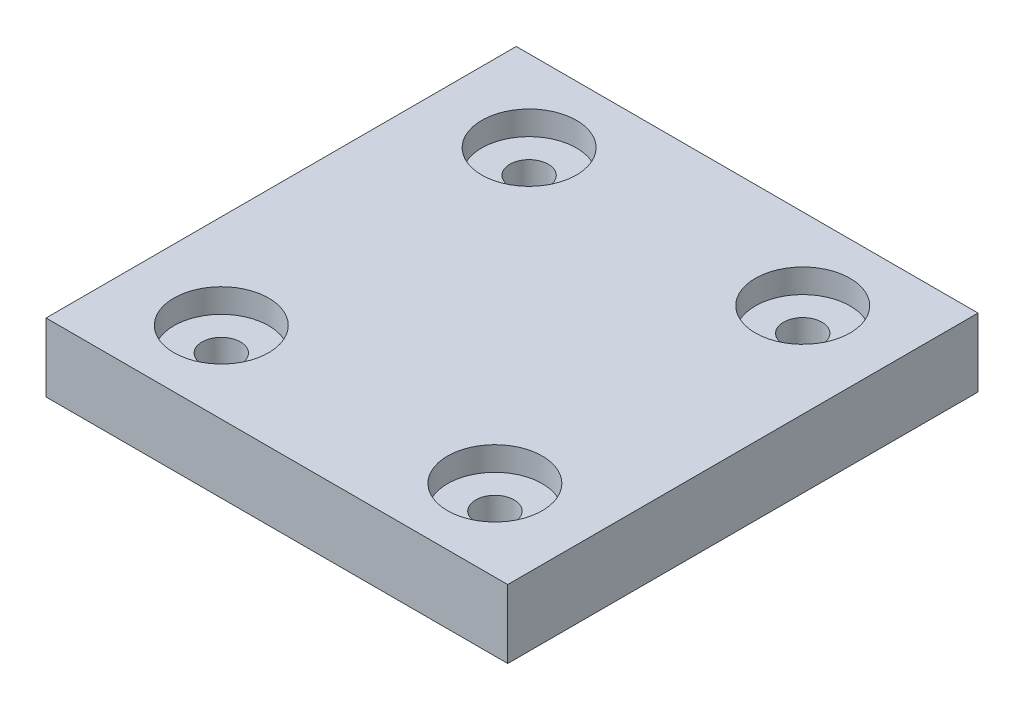
ISO-10303-21;
HEADER;
FILE_DESCRIPTION(('STEP AP214'),'2;1');
FILE_NAME('part.step','',(''),(''),'','','');
FILE_SCHEMA(('AUTOMOTIVE_DESIGN { 1 0 10303 214 1 1 1 1 }'));
ENDSEC;
DATA;
#1=APPLICATION_CONTEXT('core data for automotive mechanical design processes');
#2=APPLICATION_PROTOCOL_DEFINITION('international standard','automotive_design',2000,#1);
#3=PRODUCT_CONTEXT('',#1,'mechanical');
#4=PRODUCT('Part','Part','',(#3));
#5=PRODUCT_RELATED_PRODUCT_CATEGORY('part','',(#4));
#6=PRODUCT_DEFINITION_FORMATION('','',#4);
#7=PRODUCT_DEFINITION_CONTEXT('part definition',#1,'design');
#8=PRODUCT_DEFINITION('design','',#6,#7);
#9=PRODUCT_DEFINITION_SHAPE('','',#8);
#10=(LENGTH_UNIT() NAMED_UNIT(*) SI_UNIT(.MILLI.,.METRE.));
#11=(NAMED_UNIT(*) PLANE_ANGLE_UNIT() SI_UNIT($,.RADIAN.));
#12=(NAMED_UNIT(*) SI_UNIT($,.STERADIAN.) SOLID_ANGLE_UNIT());
#13=UNCERTAINTY_MEASURE_WITH_UNIT(LENGTH_MEASURE(1.E-05),#10,'distance_accuracy_value','');
#14=(GEOMETRIC_REPRESENTATION_CONTEXT(3) GLOBAL_UNCERTAINTY_ASSIGNED_CONTEXT((#13)) GLOBAL_UNIT_ASSIGNED_CONTEXT((#10,
#11,#12)) REPRESENTATION_CONTEXT('',''));
#15=CARTESIAN_POINT('',(0.,0.,0.));
#16=DIRECTION('',(0.,0.,1.));
#17=DIRECTION('',(1.,0.,0.));
#18=AXIS2_PLACEMENT_3D('',#15,#16,#17);
#19=CARTESIAN_POINT('',(27.,8.,-27.5));
#20=DIRECTION('',(-1.,0.,0.));
#21=DIRECTION('',(0.,0.,1.));
#22=AXIS2_PLACEMENT_3D('',#19,#20,#21);
#23=PLANE('',#22);
#24=DIRECTION('',(0.,0.,-1.));
#25=VECTOR('',#24,1.);
#26=CARTESIAN_POINT('',(27.,0.,-27.5));
#27=LINE('',#26,#25);
#28=CARTESIAN_POINT('',(27.,0.,27.5));
#29=VERTEX_POINT('',#28);
#30=CARTESIAN_POINT('',(27.,0.,-27.5));
#31=VERTEX_POINT('',#30);
#32=EDGE_CURVE('E107',#29,#31,#27,.T.);
#33=ORIENTED_EDGE('',*,*,#32,.T.);
#34=DIRECTION('',(0.,-1.,0.));
#35=VECTOR('',#34,1.);
#36=CARTESIAN_POINT('',(27.,8.,-27.5));
#37=LINE('',#36,#35);
#38=CARTESIAN_POINT('',(27.,8.,-27.5));
#39=VERTEX_POINT('',#38);
#40=EDGE_CURVE('E11',#39,#31,#37,.T.);
#41=ORIENTED_EDGE('',*,*,#40,.F.);
#42=DIRECTION('',(0.,0.,-1.));
#43=VECTOR('',#42,1.);
#44=CARTESIAN_POINT('',(27.,8.,-27.5));
#45=LINE('',#44,#43);
#46=CARTESIAN_POINT('',(27.,8.,27.5));
#47=VERTEX_POINT('',#46);
#48=EDGE_CURVE('E91',#47,#39,#45,.T.);
#49=ORIENTED_EDGE('',*,*,#48,.F.);
#50=DIRECTION('',(0.,-1.,0.));
#51=VECTOR('',#50,1.);
#52=CARTESIAN_POINT('',(27.,8.,27.5));
#53=LINE('',#52,#51);
#54=EDGE_CURVE('E103',#47,#29,#53,.T.);
#55=ORIENTED_EDGE('',*,*,#54,.T.);
#56=EDGE_LOOP('',(#33,#41,#49,#55));
#57=FACE_BOUND('',#56,.T.);
#58=ADVANCED_FACE('F39',(#57),#23,.F.);
#59=CARTESIAN_POINT('',(-27.,8.,-27.5));
#60=DIRECTION('',(0.,0.,1.));
#61=DIRECTION('',(1.,0.,0.));
#62=AXIS2_PLACEMENT_3D('',#59,#60,#61);
#63=PLANE('',#62);
#64=DIRECTION('',(-1.,0.,0.));
#65=VECTOR('',#64,1.);
#66=CARTESIAN_POINT('',(-27.,0.,-27.5));
#67=LINE('',#66,#65);
#68=CARTESIAN_POINT('',(-27.,0.,-27.5));
#69=VERTEX_POINT('',#68);
#70=EDGE_CURVE('E96',#31,#69,#67,.T.);
#71=ORIENTED_EDGE('',*,*,#70,.T.);
#72=DIRECTION('',(0.,-1.,0.));
#73=VECTOR('',#72,1.);
#74=CARTESIAN_POINT('',(-27.,8.,-27.5));
#75=LINE('',#74,#73);
#76=CARTESIAN_POINT('',(-27.,8.,-27.5));
#77=VERTEX_POINT('',#76);
#78=EDGE_CURVE('E48',#77,#69,#75,.T.);
#79=ORIENTED_EDGE('',*,*,#78,.F.);
#80=DIRECTION('',(-1.,0.,0.));
#81=VECTOR('',#80,1.);
#82=CARTESIAN_POINT('',(-27.,8.,-27.5));
#83=LINE('',#82,#81);
#84=EDGE_CURVE('E86',#39,#77,#83,.T.);
#85=ORIENTED_EDGE('',*,*,#84,.F.);
#86=ORIENTED_EDGE('',*,*,#40,.T.);
#87=EDGE_LOOP('',(#71,#79,#85,#86));
#88=FACE_BOUND('',#87,.T.);
#89=ADVANCED_FACE('F95',(#88),#63,.F.);
#90=CARTESIAN_POINT('',(-27.,8.,-27.5));
#91=DIRECTION('',(1.,0.,0.));
#92=DIRECTION('',(0.,0.,-1.));
#93=AXIS2_PLACEMENT_3D('',#90,#91,#92);
#94=PLANE('',#93);
#95=DIRECTION('',(0.,0.,1.));
#96=VECTOR('',#95,1.);
#97=CARTESIAN_POINT('',(-27.,0.,-27.5));
#98=LINE('',#97,#96);
#99=CARTESIAN_POINT('',(-27.,0.,27.5));
#100=VERTEX_POINT('',#99);
#101=EDGE_CURVE('E73',#69,#100,#98,.T.);
#102=ORIENTED_EDGE('',*,*,#101,.T.);
#103=DIRECTION('',(0.,-1.,0.));
#104=VECTOR('',#103,1.);
#105=CARTESIAN_POINT('',(-27.,8.,27.5));
#106=LINE('',#105,#104);
#107=CARTESIAN_POINT('',(-27.,8.,27.5));
#108=VERTEX_POINT('',#107);
#109=EDGE_CURVE('E98',#108,#100,#106,.T.);
#110=ORIENTED_EDGE('',*,*,#109,.F.);
#111=DIRECTION('',(0.,0.,1.));
#112=VECTOR('',#111,1.);
#113=CARTESIAN_POINT('',(-27.,8.,-27.5));
#114=LINE('',#113,#112);
#115=EDGE_CURVE('E89',#77,#108,#114,.T.);
#116=ORIENTED_EDGE('',*,*,#115,.F.);
#117=ORIENTED_EDGE('',*,*,#78,.T.);
#118=EDGE_LOOP('',(#102,#110,#116,#117));
#119=FACE_BOUND('',#118,.T.);
#120=ADVANCED_FACE('F99',(#119),#94,.F.);
#121=CARTESIAN_POINT('',(-27.,8.,27.5));
#122=DIRECTION('',(0.,0.,-1.));
#123=DIRECTION('',(-1.,0.,0.));
#124=AXIS2_PLACEMENT_3D('',#121,#122,#123);
#125=PLANE('',#124);
#126=DIRECTION('',(1.,0.,0.));
#127=VECTOR('',#126,1.);
#128=CARTESIAN_POINT('',(-27.,0.,27.5));
#129=LINE('',#128,#127);
#130=EDGE_CURVE('E79',#100,#29,#129,.T.);
#131=ORIENTED_EDGE('',*,*,#130,.T.);
#132=ORIENTED_EDGE('',*,*,#54,.F.);
#133=DIRECTION('',(1.,0.,0.));
#134=VECTOR('',#133,1.);
#135=CARTESIAN_POINT('',(-27.,8.,27.5));
#136=LINE('',#135,#134);
#137=EDGE_CURVE('E56',#108,#47,#136,.T.);
#138=ORIENTED_EDGE('',*,*,#137,.F.);
#139=ORIENTED_EDGE('',*,*,#109,.T.);
#140=EDGE_LOOP('',(#131,#132,#138,#139));
#141=FACE_BOUND('',#140,.T.);
#142=ADVANCED_FACE('F121',(#141),#125,.F.);
#143=CARTESIAN_POINT('',(0.,8.,0.));
#144=DIRECTION('',(0.,1.,0.));
#145=DIRECTION('',(0.,0.,1.));
#146=AXIS2_PLACEMENT_3D('',#143,#144,#145);
#147=PLANE('',#146);
#148=CARTESIAN_POINT('',(-16.,8.,-18.));
#149=DIRECTION('',(0.,1.,0.));
#150=DIRECTION('',(0.,0.,1.));
#151=AXIS2_PLACEMENT_3D('',#148,#149,#150);
#152=CIRCLE('',#151,5.5415);
#153=CARTESIAN_POINT('',(-16.,8.,-12.4585));
#154=VERTEX_POINT('',#153);
#155=EDGE_CURVE('E187',#154,#154,#152,.T.);
#156=ORIENTED_EDGE('',*,*,#155,.F.);
#157=EDGE_LOOP('',(#156));
#158=FACE_BOUND('',#157,.T.);
#159=CARTESIAN_POINT('',(16.,8.,-18.));
#160=DIRECTION('',(0.,1.,0.));
#161=DIRECTION('',(0.,0.,1.));
#162=AXIS2_PLACEMENT_3D('',#159,#160,#161);
#163=CIRCLE('',#162,5.5415);
#164=CARTESIAN_POINT('',(16.,8.,-12.4585));
#165=VERTEX_POINT('',#164);
#166=EDGE_CURVE('E171',#165,#165,#163,.T.);
#167=ORIENTED_EDGE('',*,*,#166,.F.);
#168=EDGE_LOOP('',(#167));
#169=FACE_BOUND('',#168,.T.);
#170=CARTESIAN_POINT('',(16.,8.,18.));
#171=DIRECTION('',(0.,1.,0.));
#172=DIRECTION('',(0.,0.,1.));
#173=AXIS2_PLACEMENT_3D('',#170,#171,#172);
#174=CIRCLE('',#173,5.5415);
#175=CARTESIAN_POINT('',(16.,8.,23.5415));
#176=VERTEX_POINT('',#175);
#177=EDGE_CURVE('E155',#176,#176,#174,.T.);
#178=ORIENTED_EDGE('',*,*,#177,.F.);
#179=EDGE_LOOP('',(#178));
#180=FACE_BOUND('',#179,.T.);
#181=CARTESIAN_POINT('',(-16.,8.,18.));
#182=DIRECTION('',(0.,1.,0.));
#183=DIRECTION('',(0.,0.,1.));
#184=AXIS2_PLACEMENT_3D('',#181,#182,#183);
#185=CIRCLE('',#184,5.5415);
#186=CARTESIAN_POINT('',(-16.,8.,23.5415));
#187=VERTEX_POINT('',#186);
#188=EDGE_CURVE('E139',#187,#187,#185,.T.);
#189=ORIENTED_EDGE('',*,*,#188,.F.);
#190=EDGE_LOOP('',(#189));
#191=FACE_BOUND('',#190,.T.);
#192=ORIENTED_EDGE('',*,*,#48,.T.);
#193=ORIENTED_EDGE('',*,*,#84,.T.);
#194=ORIENTED_EDGE('',*,*,#115,.T.);
#195=ORIENTED_EDGE('',*,*,#137,.T.);
#196=EDGE_LOOP('',(#192,#193,#194,#195));
#197=FACE_BOUND('',#196,.T.);
#198=ADVANCED_FACE('F87',(#158,#169,#180,#191,#197),#147,.T.);
#199=CARTESIAN_POINT('',(0.,0.,0.));
#200=DIRECTION('',(0.,1.,0.));
#201=DIRECTION('',(0.,0.,1.));
#202=AXIS2_PLACEMENT_3D('',#199,#200,#201);
#203=PLANE('',#202);
#204=CARTESIAN_POINT('',(-16.,0.,-18.));
#205=DIRECTION('',(0.,1.,0.));
#206=DIRECTION('',(0.,0.,1.));
#207=AXIS2_PLACEMENT_3D('',#204,#205,#206);
#208=CIRCLE('',#207,2.25);
#209=CARTESIAN_POINT('',(-16.,0.,-15.75));
#210=VERTEX_POINT('',#209);
#211=EDGE_CURVE('E175',#210,#210,#208,.T.);
#212=ORIENTED_EDGE('',*,*,#211,.T.);
#213=EDGE_LOOP('',(#212));
#214=FACE_BOUND('',#213,.T.);
#215=CARTESIAN_POINT('',(16.,0.,-18.));
#216=DIRECTION('',(0.,1.,0.));
#217=DIRECTION('',(0.,0.,1.));
#218=AXIS2_PLACEMENT_3D('',#215,#216,#217);
#219=CIRCLE('',#218,2.25);
#220=CARTESIAN_POINT('',(16.,0.,-15.75));
#221=VERTEX_POINT('',#220);
#222=EDGE_CURVE('E159',#221,#221,#219,.T.);
#223=ORIENTED_EDGE('',*,*,#222,.T.);
#224=EDGE_LOOP('',(#223));
#225=FACE_BOUND('',#224,.T.);
#226=CARTESIAN_POINT('',(16.,0.,18.));
#227=DIRECTION('',(0.,1.,0.));
#228=DIRECTION('',(0.,0.,1.));
#229=AXIS2_PLACEMENT_3D('',#226,#227,#228);
#230=CIRCLE('',#229,2.25);
#231=CARTESIAN_POINT('',(16.,0.,20.25));
#232=VERTEX_POINT('',#231);
#233=EDGE_CURVE('E143',#232,#232,#230,.T.);
#234=ORIENTED_EDGE('',*,*,#233,.T.);
#235=EDGE_LOOP('',(#234));
#236=FACE_BOUND('',#235,.T.);
#237=CARTESIAN_POINT('',(-16.,0.,18.));
#238=DIRECTION('',(0.,1.,0.));
#239=DIRECTION('',(0.,0.,1.));
#240=AXIS2_PLACEMENT_3D('',#237,#238,#239);
#241=CIRCLE('',#240,2.25);
#242=CARTESIAN_POINT('',(-16.,0.,20.25));
#243=VERTEX_POINT('',#242);
#244=EDGE_CURVE('E111',#243,#243,#241,.T.);
#245=ORIENTED_EDGE('',*,*,#244,.T.);
#246=EDGE_LOOP('',(#245));
#247=FACE_BOUND('',#246,.T.);
#248=ORIENTED_EDGE('',*,*,#32,.F.);
#249=ORIENTED_EDGE('',*,*,#130,.F.);
#250=ORIENTED_EDGE('',*,*,#101,.F.);
#251=ORIENTED_EDGE('',*,*,#70,.F.);
#252=EDGE_LOOP('',(#248,#249,#250,#251));
#253=FACE_BOUND('',#252,.T.);
#254=ADVANCED_FACE('F124',(#214,#225,#236,#247,#253),#203,.F.);
#255=CARTESIAN_POINT('',(-16.,8.,18.));
#256=DIRECTION('',(0.,1.,0.));
#257=DIRECTION('',(0.,0.,1.));
#258=AXIS2_PLACEMENT_3D('',#255,#256,#257);
#259=CYLINDRICAL_SURFACE('',#258,2.25);
#260=ORIENTED_EDGE('',*,*,#244,.F.);
#261=EDGE_LOOP('',(#260));
#262=FACE_BOUND('',#261,.T.);
#263=CARTESIAN_POINT('',(-16.,5.2,18.));
#264=DIRECTION('',(0.,1.,0.));
#265=DIRECTION('',(0.,0.,1.));
#266=AXIS2_PLACEMENT_3D('',#263,#264,#265);
#267=CIRCLE('',#266,2.25);
#268=CARTESIAN_POINT('',(-16.,5.2,20.25));
#269=VERTEX_POINT('',#268);
#270=EDGE_CURVE('E131',#269,#269,#267,.T.);
#271=ORIENTED_EDGE('',*,*,#270,.T.);
#272=EDGE_LOOP('',(#271));
#273=FACE_BOUND('',#272,.T.);
#274=ADVANCED_FACE('F216',(#262,#273),#259,.F.);
#275=CARTESIAN_POINT('',(-13.75,5.2,18.));
#276=DIRECTION('',(0.,-1.,0.));
#277=DIRECTION('',(0.,0.,-1.));
#278=AXIS2_PLACEMENT_3D('',#275,#276,#277);
#279=PLANE('',#278);
#280=ORIENTED_EDGE('',*,*,#270,.F.);
#281=EDGE_LOOP('',(#280));
#282=FACE_BOUND('',#281,.T.);
#283=CARTESIAN_POINT('',(-16.,5.2,18.));
#284=DIRECTION('',(0.,1.,0.));
#285=DIRECTION('',(0.,0.,1.));
#286=AXIS2_PLACEMENT_3D('',#283,#284,#285);
#287=CIRCLE('',#286,5.5415);
#288=CARTESIAN_POINT('',(-16.,5.2,23.5415));
#289=VERTEX_POINT('',#288);
#290=EDGE_CURVE('E135',#289,#289,#287,.T.);
#291=ORIENTED_EDGE('',*,*,#290,.T.);
#292=EDGE_LOOP('',(#291));
#293=FACE_BOUND('',#292,.T.);
#294=ADVANCED_FACE('F206',(#282,#293),#279,.F.);
#295=CARTESIAN_POINT('',(-16.,8.,18.));
#296=DIRECTION('',(0.,1.,0.));
#297=DIRECTION('',(0.,0.,1.));
#298=AXIS2_PLACEMENT_3D('',#295,#296,#297);
#299=CYLINDRICAL_SURFACE('',#298,5.5415);
#300=ORIENTED_EDGE('',*,*,#290,.F.);
#301=EDGE_LOOP('',(#300));
#302=FACE_BOUND('',#301,.T.);
#303=ORIENTED_EDGE('',*,*,#188,.T.);
#304=EDGE_LOOP('',(#303));
#305=FACE_BOUND('',#304,.T.);
#306=ADVANCED_FACE('F203',(#302,#305),#299,.F.);
#307=CARTESIAN_POINT('',(16.,8.,18.));
#308=DIRECTION('',(0.,1.,0.));
#309=DIRECTION('',(0.,0.,1.));
#310=AXIS2_PLACEMENT_3D('',#307,#308,#309);
#311=CYLINDRICAL_SURFACE('',#310,2.25);
#312=ORIENTED_EDGE('',*,*,#233,.F.);
#313=EDGE_LOOP('',(#312));
#314=FACE_BOUND('',#313,.T.);
#315=CARTESIAN_POINT('',(16.,5.2,18.));
#316=DIRECTION('',(0.,1.,0.));
#317=DIRECTION('',(0.,0.,1.));
#318=AXIS2_PLACEMENT_3D('',#315,#316,#317);
#319=CIRCLE('',#318,2.25);
#320=CARTESIAN_POINT('',(16.,5.2,20.25));
#321=VERTEX_POINT('',#320);
#322=EDGE_CURVE('E147',#321,#321,#319,.T.);
#323=ORIENTED_EDGE('',*,*,#322,.T.);
#324=EDGE_LOOP('',(#323));
#325=FACE_BOUND('',#324,.T.);
#326=ADVANCED_FACE('F205',(#314,#325),#311,.F.);
#327=CARTESIAN_POINT('',(18.25,5.2,18.));
#328=DIRECTION('',(0.,-1.,0.));
#329=DIRECTION('',(0.,0.,-1.));
#330=AXIS2_PLACEMENT_3D('',#327,#328,#329);
#331=PLANE('',#330);
#332=ORIENTED_EDGE('',*,*,#322,.F.);
#333=EDGE_LOOP('',(#332));
#334=FACE_BOUND('',#333,.T.);
#335=CARTESIAN_POINT('',(16.,5.2,18.));
#336=DIRECTION('',(0.,1.,0.));
#337=DIRECTION('',(0.,0.,1.));
#338=AXIS2_PLACEMENT_3D('',#335,#336,#337);
#339=CIRCLE('',#338,5.5415);
#340=CARTESIAN_POINT('',(16.,5.2,23.5415));
#341=VERTEX_POINT('',#340);
#342=EDGE_CURVE('E151',#341,#341,#339,.T.);
#343=ORIENTED_EDGE('',*,*,#342,.T.);
#344=EDGE_LOOP('',(#343));
#345=FACE_BOUND('',#344,.T.);
#346=ADVANCED_FACE('F213',(#334,#345),#331,.F.);
#347=CARTESIAN_POINT('',(16.,8.,18.));
#348=DIRECTION('',(0.,1.,0.));
#349=DIRECTION('',(0.,0.,1.));
#350=AXIS2_PLACEMENT_3D('',#347,#348,#349);
#351=CYLINDRICAL_SURFACE('',#350,5.5415);
#352=ORIENTED_EDGE('',*,*,#342,.F.);
#353=EDGE_LOOP('',(#352));
#354=FACE_BOUND('',#353,.T.);
#355=ORIENTED_EDGE('',*,*,#177,.T.);
#356=EDGE_LOOP('',(#355));
#357=FACE_BOUND('',#356,.T.);
#358=ADVANCED_FACE('F268',(#354,#357),#351,.F.);
#359=CARTESIAN_POINT('',(16.,8.,-18.));
#360=DIRECTION('',(0.,1.,0.));
#361=DIRECTION('',(0.,0.,1.));
#362=AXIS2_PLACEMENT_3D('',#359,#360,#361);
#363=CYLINDRICAL_SURFACE('',#362,2.25);
#364=ORIENTED_EDGE('',*,*,#222,.F.);
#365=EDGE_LOOP('',(#364));
#366=FACE_BOUND('',#365,.T.);
#367=CARTESIAN_POINT('',(16.,5.2,-18.));
#368=DIRECTION('',(0.,1.,0.));
#369=DIRECTION('',(0.,0.,1.));
#370=AXIS2_PLACEMENT_3D('',#367,#368,#369);
#371=CIRCLE('',#370,2.25);
#372=CARTESIAN_POINT('',(16.,5.2,-15.75));
#373=VERTEX_POINT('',#372);
#374=EDGE_CURVE('E163',#373,#373,#371,.T.);
#375=ORIENTED_EDGE('',*,*,#374,.T.);
#376=EDGE_LOOP('',(#375));
#377=FACE_BOUND('',#376,.T.);
#378=ADVANCED_FACE('F278',(#366,#377),#363,.F.);
#379=CARTESIAN_POINT('',(18.25,5.2,-18.));
#380=DIRECTION('',(0.,-1.,0.));
#381=DIRECTION('',(0.,0.,-1.));
#382=AXIS2_PLACEMENT_3D('',#379,#380,#381);
#383=PLANE('',#382);
#384=ORIENTED_EDGE('',*,*,#374,.F.);
#385=EDGE_LOOP('',(#384));
#386=FACE_BOUND('',#385,.T.);
#387=CARTESIAN_POINT('',(16.,5.2,-18.));
#388=DIRECTION('',(0.,1.,0.));
#389=DIRECTION('',(0.,0.,1.));
#390=AXIS2_PLACEMENT_3D('',#387,#388,#389);
#391=CIRCLE('',#390,5.5415);
#392=CARTESIAN_POINT('',(16.,5.2,-12.4585));
#393=VERTEX_POINT('',#392);
#394=EDGE_CURVE('E167',#393,#393,#391,.T.);
#395=ORIENTED_EDGE('',*,*,#394,.T.);
#396=EDGE_LOOP('',(#395));
#397=FACE_BOUND('',#396,.T.);
#398=ADVANCED_FACE('F288',(#386,#397),#383,.F.);
#399=CARTESIAN_POINT('',(16.,8.,-18.));
#400=DIRECTION('',(0.,1.,0.));
#401=DIRECTION('',(0.,0.,1.));
#402=AXIS2_PLACEMENT_3D('',#399,#400,#401);
#403=CYLINDRICAL_SURFACE('',#402,5.5415);
#404=ORIENTED_EDGE('',*,*,#394,.F.);
#405=EDGE_LOOP('',(#404));
#406=FACE_BOUND('',#405,.T.);
#407=ORIENTED_EDGE('',*,*,#166,.T.);
#408=EDGE_LOOP('',(#407));
#409=FACE_BOUND('',#408,.T.);
#410=ADVANCED_FACE('F298',(#406,#409),#403,.F.);
#411=CARTESIAN_POINT('',(-16.,8.,-18.));
#412=DIRECTION('',(0.,1.,0.));
#413=DIRECTION('',(0.,0.,1.));
#414=AXIS2_PLACEMENT_3D('',#411,#412,#413);
#415=CYLINDRICAL_SURFACE('',#414,2.25);
#416=ORIENTED_EDGE('',*,*,#211,.F.);
#417=EDGE_LOOP('',(#416));
#418=FACE_BOUND('',#417,.T.);
#419=CARTESIAN_POINT('',(-16.,5.2,-18.));
#420=DIRECTION('',(0.,1.,0.));
#421=DIRECTION('',(0.,0.,1.));
#422=AXIS2_PLACEMENT_3D('',#419,#420,#421);
#423=CIRCLE('',#422,2.25);
#424=CARTESIAN_POINT('',(-16.,5.2,-15.75));
#425=VERTEX_POINT('',#424);
#426=EDGE_CURVE('E179',#425,#425,#423,.T.);
#427=ORIENTED_EDGE('',*,*,#426,.T.);
#428=EDGE_LOOP('',(#427));
#429=FACE_BOUND('',#428,.T.);
#430=ADVANCED_FACE('F308',(#418,#429),#415,.F.);
#431=CARTESIAN_POINT('',(-13.75,5.2,-18.));
#432=DIRECTION('',(0.,-1.,0.));
#433=DIRECTION('',(0.,0.,-1.));
#434=AXIS2_PLACEMENT_3D('',#431,#432,#433);
#435=PLANE('',#434);
#436=ORIENTED_EDGE('',*,*,#426,.F.);
#437=EDGE_LOOP('',(#436));
#438=FACE_BOUND('',#437,.T.);
#439=CARTESIAN_POINT('',(-16.,5.2,-18.));
#440=DIRECTION('',(0.,1.,0.));
#441=DIRECTION('',(0.,0.,1.));
#442=AXIS2_PLACEMENT_3D('',#439,#440,#441);
#443=CIRCLE('',#442,5.5415);
#444=CARTESIAN_POINT('',(-16.,5.2,-12.4585));
#445=VERTEX_POINT('',#444);
#446=EDGE_CURVE('E183',#445,#445,#443,.T.);
#447=ORIENTED_EDGE('',*,*,#446,.T.);
#448=EDGE_LOOP('',(#447));
#449=FACE_BOUND('',#448,.T.);
#450=ADVANCED_FACE('F318',(#438,#449),#435,.F.);
#451=CARTESIAN_POINT('',(-16.,8.,-18.));
#452=DIRECTION('',(0.,1.,0.));
#453=DIRECTION('',(0.,0.,1.));
#454=AXIS2_PLACEMENT_3D('',#451,#452,#453);
#455=CYLINDRICAL_SURFACE('',#454,5.5415);
#456=ORIENTED_EDGE('',*,*,#446,.F.);
#457=EDGE_LOOP('',(#456));
#458=FACE_BOUND('',#457,.T.);
#459=ORIENTED_EDGE('',*,*,#155,.T.);
#460=EDGE_LOOP('',(#459));
#461=FACE_BOUND('',#460,.T.);
#462=ADVANCED_FACE('F192',(#458,#461),#455,.F.);
#463=CLOSED_SHELL('',(#58,#89,#120,#142,#198,#254,#274,#294,#306,#326,#346,#358,#378,#398,#410,
#430,#450,#462));
#464=MANIFOLD_SOLID_BREP('B2',#463);
#465=ADVANCED_BREP_SHAPE_REPRESENTATION('',(#18,#464),#14);
#466=SHAPE_DEFINITION_REPRESENTATION(#9,#465);
ENDSEC;
END-ISO-10303-21;
